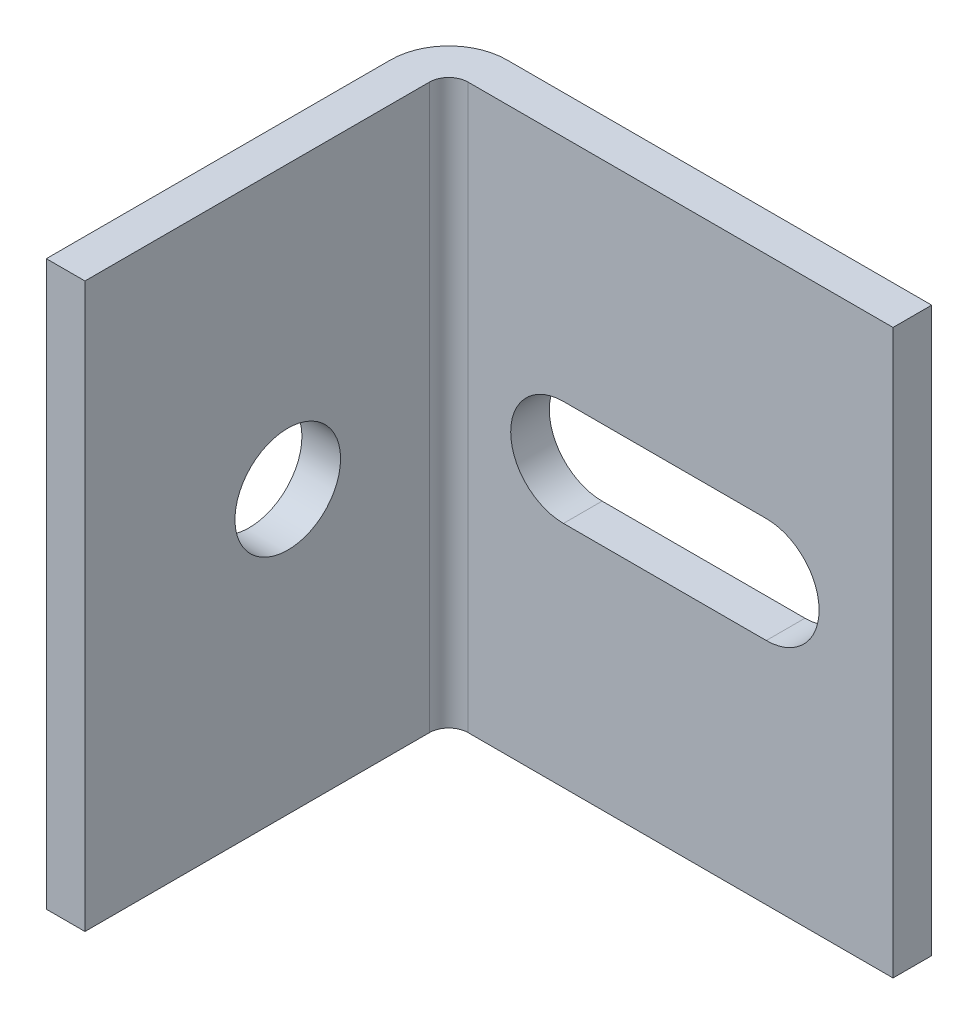
ISO-10303-21;
HEADER;
FILE_DESCRIPTION(('STEP AP214'),'2;1');
FILE_NAME('part.step','',(''),(''),'','','');
FILE_SCHEMA(('AUTOMOTIVE_DESIGN { 1 0 10303 214 1 1 1 1 }'));
ENDSEC;
DATA;
#1=APPLICATION_CONTEXT('core data for automotive mechanical design processes');
#2=APPLICATION_PROTOCOL_DEFINITION('international standard','automotive_design',2000,#1);
#3=PRODUCT_CONTEXT('',#1,'mechanical');
#4=PRODUCT('Part','Part','',(#3));
#5=PRODUCT_RELATED_PRODUCT_CATEGORY('part','',(#4));
#6=PRODUCT_DEFINITION_FORMATION('','',#4);
#7=PRODUCT_DEFINITION_CONTEXT('part definition',#1,'design');
#8=PRODUCT_DEFINITION('design','',#6,#7);
#9=PRODUCT_DEFINITION_SHAPE('','',#8);
#10=(LENGTH_UNIT() NAMED_UNIT(*) SI_UNIT(.MILLI.,.METRE.));
#11=(NAMED_UNIT(*) PLANE_ANGLE_UNIT() SI_UNIT($,.RADIAN.));
#12=(NAMED_UNIT(*) SI_UNIT($,.STERADIAN.) SOLID_ANGLE_UNIT());
#13=UNCERTAINTY_MEASURE_WITH_UNIT(LENGTH_MEASURE(1.E-05),#10,'distance_accuracy_value','');
#14=(GEOMETRIC_REPRESENTATION_CONTEXT(3) GLOBAL_UNCERTAINTY_ASSIGNED_CONTEXT((#13)) GLOBAL_UNIT_ASSIGNED_CONTEXT((#10,
#11,#12)) REPRESENTATION_CONTEXT('',''));
#15=CARTESIAN_POINT('',(0.,0.,0.));
#16=DIRECTION('',(0.,0.,1.));
#17=DIRECTION('',(1.,0.,0.));
#18=AXIS2_PLACEMENT_3D('',#15,#16,#17);
#19=CARTESIAN_POINT('',(2.286,11.1125,1.524));
#20=DIRECTION('',(0.,0.,-1.));
#21=DIRECTION('',(-1.,0.,0.));
#22=AXIS2_PLACEMENT_3D('',#19,#20,#21);
#23=PLANE('',#22);
#24=DIRECTION('',(1.,0.,0.));
#25=VECTOR('',#24,1.);
#26=CARTESIAN_POINT('',(2.286,-11.1125,1.524));
#27=LINE('',#26,#25);
#28=CARTESIAN_POINT('',(2.286,-11.1125,1.524));
#29=VERTEX_POINT('',#28);
#30=CARTESIAN_POINT('',(19.05,-11.1125,1.524));
#31=VERTEX_POINT('',#30);
#32=EDGE_CURVE('E158',#29,#31,#27,.T.);
#33=ORIENTED_EDGE('',*,*,#32,.T.);
#34=DIRECTION('',(0.,-1.,0.));
#35=VECTOR('',#34,1.);
#36=CARTESIAN_POINT('',(19.05,11.1125,1.524));
#37=LINE('',#36,#35);
#38=CARTESIAN_POINT('',(19.05,11.1125,1.524));
#39=VERTEX_POINT('',#38);
#40=EDGE_CURVE('E11',#39,#31,#37,.T.);
#41=ORIENTED_EDGE('',*,*,#40,.F.);
#42=DIRECTION('',(1.,0.,0.));
#43=VECTOR('',#42,1.);
#44=CARTESIAN_POINT('',(2.286,11.1125,1.524));
#45=LINE('',#44,#43);
#46=CARTESIAN_POINT('',(2.286,11.1125,1.524));
#47=VERTEX_POINT('',#46);
#48=EDGE_CURVE('E161',#47,#39,#45,.T.);
#49=ORIENTED_EDGE('',*,*,#48,.F.);
#50=DIRECTION('',(0.,-1.,0.));
#51=VECTOR('',#50,1.);
#52=CARTESIAN_POINT('',(2.286,11.1125,1.524));
#53=LINE('',#52,#51);
#54=EDGE_CURVE('E183',#47,#29,#53,.T.);
#55=ORIENTED_EDGE('',*,*,#54,.T.);
#56=EDGE_LOOP('',(#33,#41,#49,#55));
#57=FACE_BOUND('',#56,.T.);
#58=CARTESIAN_POINT('',(6.05,0.,1.524));
#59=DIRECTION('',(0.,0.,-1.));
#60=DIRECTION('',(-1.,0.,0.));
#61=AXIS2_PLACEMENT_3D('',#58,#59,#60);
#62=CIRCLE('',#61,2.0828);
#63=CARTESIAN_POINT('',(6.05,2.0828,1.524));
#64=VERTEX_POINT('',#63);
#65=CARTESIAN_POINT('',(6.05,-2.0828,1.524));
#66=VERTEX_POINT('',#65);
#67=EDGE_CURVE('E122',#64,#66,#62,.F.);
#68=ORIENTED_EDGE('',*,*,#67,.F.);
#69=DIRECTION('',(-1.,0.,0.));
#70=VECTOR('',#69,1.);
#71=CARTESIAN_POINT('',(2.286,2.0828,1.524));
#72=LINE('',#71,#70);
#73=CARTESIAN_POINT('',(14.05,2.0828,1.524));
#74=VERTEX_POINT('',#73);
#75=EDGE_CURVE('E125',#74,#64,#72,.T.);
#76=ORIENTED_EDGE('',*,*,#75,.F.);
#77=CARTESIAN_POINT('',(14.05,0.,1.524));
#78=DIRECTION('',(0.,0.,-1.));
#79=DIRECTION('',(-1.,0.,0.));
#80=AXIS2_PLACEMENT_3D('',#77,#78,#79);
#81=CIRCLE('',#80,2.0828);
#82=CARTESIAN_POINT('',(14.05,-2.0828,1.524));
#83=VERTEX_POINT('',#82);
#84=EDGE_CURVE('E149',#83,#74,#81,.F.);
#85=ORIENTED_EDGE('',*,*,#84,.F.);
#86=DIRECTION('',(1.,0.,0.));
#87=VECTOR('',#86,1.);
#88=CARTESIAN_POINT('',(2.286,-2.0828,1.524));
#89=LINE('',#88,#87);
#90=EDGE_CURVE('E151',#66,#83,#89,.T.);
#91=ORIENTED_EDGE('',*,*,#90,.F.);
#92=EDGE_LOOP('',(#68,#76,#85,#91));
#93=FACE_BOUND('',#92,.T.);
#94=ADVANCED_FACE('F32',(#57,#93),#23,.F.);
#95=CARTESIAN_POINT('',(2.286,11.1125,0.));
#96=DIRECTION('',(0.,0.,-1.));
#97=DIRECTION('',(-1.,0.,0.));
#98=AXIS2_PLACEMENT_3D('',#95,#96,#97);
#99=PLANE('',#98);
#100=DIRECTION('',(1.,0.,0.));
#101=VECTOR('',#100,1.);
#102=CARTESIAN_POINT('',(2.286,-11.1125,0.));
#103=LINE('',#102,#101);
#104=CARTESIAN_POINT('',(2.286,-11.1125,0.));
#105=VERTEX_POINT('',#104);
#106=CARTESIAN_POINT('',(19.05,-11.1125,0.));
#107=VERTEX_POINT('',#106);
#108=EDGE_CURVE('E189',#105,#107,#103,.T.);
#109=ORIENTED_EDGE('',*,*,#108,.F.);
#110=DIRECTION('',(0.,-1.,0.));
#111=VECTOR('',#110,1.);
#112=CARTESIAN_POINT('',(2.286,11.1125,0.));
#113=LINE('',#112,#111);
#114=CARTESIAN_POINT('',(2.286,11.1125,0.));
#115=VERTEX_POINT('',#114);
#116=EDGE_CURVE('E215',#115,#105,#113,.T.);
#117=ORIENTED_EDGE('',*,*,#116,.F.);
#118=DIRECTION('',(1.,0.,0.));
#119=VECTOR('',#118,1.);
#120=CARTESIAN_POINT('',(2.286,11.1125,0.));
#121=LINE('',#120,#119);
#122=CARTESIAN_POINT('',(19.05,11.1125,0.));
#123=VERTEX_POINT('',#122);
#124=EDGE_CURVE('E167',#115,#123,#121,.T.);
#125=ORIENTED_EDGE('',*,*,#124,.T.);
#126=DIRECTION('',(0.,-1.,0.));
#127=VECTOR('',#126,1.);
#128=CARTESIAN_POINT('',(19.05,11.1125,0.));
#129=LINE('',#128,#127);
#130=EDGE_CURVE('E39',#123,#107,#129,.T.);
#131=ORIENTED_EDGE('',*,*,#130,.T.);
#132=EDGE_LOOP('',(#109,#117,#125,#131));
#133=FACE_BOUND('',#132,.T.);
#134=DIRECTION('',(-1.,0.,0.));
#135=VECTOR('',#134,1.);
#136=CARTESIAN_POINT('',(6.05,2.0828,0.));
#137=LINE('',#136,#135);
#138=CARTESIAN_POINT('',(14.05,2.0828,0.));
#139=VERTEX_POINT('',#138);
#140=CARTESIAN_POINT('',(6.05,2.0828,0.));
#141=VERTEX_POINT('',#140);
#142=EDGE_CURVE('E139',#139,#141,#137,.T.);
#143=ORIENTED_EDGE('',*,*,#142,.T.);
#144=CARTESIAN_POINT('',(6.05,0.,0.));
#145=DIRECTION('',(0.,0.,1.));
#146=DIRECTION('',(1.,0.,0.));
#147=AXIS2_PLACEMENT_3D('',#144,#145,#146);
#148=CIRCLE('',#147,2.0828);
#149=CARTESIAN_POINT('',(6.05,-2.0828,0.));
#150=VERTEX_POINT('',#149);
#151=EDGE_CURVE('E54',#141,#150,#148,.T.);
#152=ORIENTED_EDGE('',*,*,#151,.T.);
#153=DIRECTION('',(1.,0.,0.));
#154=VECTOR('',#153,1.);
#155=CARTESIAN_POINT('',(6.05,-2.0828,0.));
#156=LINE('',#155,#154);
#157=CARTESIAN_POINT('',(14.05,-2.0828,0.));
#158=VERTEX_POINT('',#157);
#159=EDGE_CURVE('E129',#150,#158,#156,.T.);
#160=ORIENTED_EDGE('',*,*,#159,.T.);
#161=CARTESIAN_POINT('',(14.05,0.,0.));
#162=DIRECTION('',(0.,0.,1.));
#163=DIRECTION('',(1.,0.,0.));
#164=AXIS2_PLACEMENT_3D('',#161,#162,#163);
#165=CIRCLE('',#164,2.0828);
#166=EDGE_CURVE('E135',#158,#139,#165,.T.);
#167=ORIENTED_EDGE('',*,*,#166,.T.);
#168=EDGE_LOOP('',(#143,#152,#160,#167));
#169=FACE_BOUND('',#168,.T.);
#170=ADVANCED_FACE('F138',(#133,#169),#99,.T.);
#171=CARTESIAN_POINT('',(19.05,11.1125,0.));
#172=DIRECTION('',(1.,0.,0.));
#173=DIRECTION('',(0.,0.,-1.));
#174=AXIS2_PLACEMENT_3D('',#171,#172,#173);
#175=PLANE('',#174);
#176=DIRECTION('',(0.,0.,1.));
#177=VECTOR('',#176,1.);
#178=CARTESIAN_POINT('',(19.05,-11.1125,0.));
#179=LINE('',#178,#177);
#180=EDGE_CURVE('E186',#107,#31,#179,.T.);
#181=ORIENTED_EDGE('',*,*,#180,.F.);
#182=ORIENTED_EDGE('',*,*,#130,.F.);
#183=DIRECTION('',(0.,0.,1.));
#184=VECTOR('',#183,1.);
#185=CARTESIAN_POINT('',(19.05,11.1125,0.));
#186=LINE('',#185,#184);
#187=EDGE_CURVE('E163',#123,#39,#186,.T.);
#188=ORIENTED_EDGE('',*,*,#187,.T.);
#189=ORIENTED_EDGE('',*,*,#40,.T.);
#190=EDGE_LOOP('',(#181,#182,#188,#189));
#191=FACE_BOUND('',#190,.T.);
#192=ADVANCED_FACE('F222',(#191),#175,.T.);
#193=CARTESIAN_POINT('',(2.286,11.1125,2.286));
#194=DIRECTION('',(0.,-1.,0.));
#195=DIRECTION('',(0.,0.,-1.));
#196=AXIS2_PLACEMENT_3D('',#193,#194,#195);
#197=CYLINDRICAL_SURFACE('',#196,2.286);
#198=CARTESIAN_POINT('',(2.286,-11.1125,2.286));
#199=DIRECTION('',(0.,-1.,0.));
#200=DIRECTION('',(0.,0.,1.));
#201=AXIS2_PLACEMENT_3D('',#198,#199,#200);
#202=CIRCLE('',#201,2.286);
#203=CARTESIAN_POINT('',(0.,-11.1125,2.286));
#204=VERTEX_POINT('',#203);
#205=EDGE_CURVE('E192',#204,#105,#202,.T.);
#206=ORIENTED_EDGE('',*,*,#205,.F.);
#207=DIRECTION('',(0.,-1.,0.));
#208=VECTOR('',#207,1.);
#209=CARTESIAN_POINT('',(0.,11.1125,2.286));
#210=LINE('',#209,#208);
#211=CARTESIAN_POINT('',(0.,11.1125,2.286));
#212=VERTEX_POINT('',#211);
#213=EDGE_CURVE('E213',#212,#204,#210,.T.);
#214=ORIENTED_EDGE('',*,*,#213,.F.);
#215=CARTESIAN_POINT('',(2.286,11.1125,2.286));
#216=DIRECTION('',(0.,-1.,0.));
#217=DIRECTION('',(0.,0.,1.));
#218=AXIS2_PLACEMENT_3D('',#215,#216,#217);
#219=CIRCLE('',#218,2.286);
#220=EDGE_CURVE('E170',#212,#115,#219,.T.);
#221=ORIENTED_EDGE('',*,*,#220,.T.);
#222=ORIENTED_EDGE('',*,*,#116,.T.);
#223=EDGE_LOOP('',(#206,#214,#221,#222));
#224=FACE_BOUND('',#223,.T.);
#225=ADVANCED_FACE('F230',(#224),#197,.T.);
#226=CARTESIAN_POINT('',(0.,11.1125,15.875));
#227=DIRECTION('',(-1.,0.,0.));
#228=DIRECTION('',(0.,0.,1.));
#229=AXIS2_PLACEMENT_3D('',#226,#227,#228);
#230=PLANE('',#229);
#231=CARTESIAN_POINT('',(0.,0.,7.875));
#232=DIRECTION('',(1.,0.,0.));
#233=DIRECTION('',(0.,0.,-1.));
#234=AXIS2_PLACEMENT_3D('',#231,#232,#233);
#235=CIRCLE('',#234,2.0828);
#236=CARTESIAN_POINT('',(0.,0.,5.7922));
#237=VERTEX_POINT('',#236);
#238=EDGE_CURVE('E155',#237,#237,#235,.T.);
#239=ORIENTED_EDGE('',*,*,#238,.T.);
#240=EDGE_LOOP('',(#239));
#241=FACE_BOUND('',#240,.T.);
#242=DIRECTION('',(0.,0.,-1.));
#243=VECTOR('',#242,1.);
#244=CARTESIAN_POINT('',(0.,-11.1125,15.875));
#245=LINE('',#244,#243);
#246=CARTESIAN_POINT('',(0.,-11.1125,15.875));
#247=VERTEX_POINT('',#246);
#248=EDGE_CURVE('E195',#247,#204,#245,.T.);
#249=ORIENTED_EDGE('',*,*,#248,.F.);
#250=DIRECTION('',(0.,-1.,0.));
#251=VECTOR('',#250,1.);
#252=CARTESIAN_POINT('',(0.,11.1125,15.875));
#253=LINE('',#252,#251);
#254=CARTESIAN_POINT('',(0.,11.1125,15.875));
#255=VERTEX_POINT('',#254);
#256=EDGE_CURVE('E211',#255,#247,#253,.T.);
#257=ORIENTED_EDGE('',*,*,#256,.F.);
#258=DIRECTION('',(0.,0.,-1.));
#259=VECTOR('',#258,1.);
#260=CARTESIAN_POINT('',(0.,11.1125,15.875));
#261=LINE('',#260,#259);
#262=EDGE_CURVE('E173',#255,#212,#261,.T.);
#263=ORIENTED_EDGE('',*,*,#262,.T.);
#264=ORIENTED_EDGE('',*,*,#213,.T.);
#265=EDGE_LOOP('',(#249,#257,#263,#264));
#266=FACE_BOUND('',#265,.T.);
#267=ADVANCED_FACE('F253',(#241,#266),#230,.T.);
#268=CARTESIAN_POINT('',(1.524,11.1125,15.875));
#269=DIRECTION('',(0.,0.,1.));
#270=DIRECTION('',(1.,0.,0.));
#271=AXIS2_PLACEMENT_3D('',#268,#269,#270);
#272=PLANE('',#271);
#273=DIRECTION('',(-1.,0.,0.));
#274=VECTOR('',#273,1.);
#275=CARTESIAN_POINT('',(1.524,-11.1125,15.875));
#276=LINE('',#275,#274);
#277=CARTESIAN_POINT('',(1.524,-11.1125,15.875));
#278=VERTEX_POINT('',#277);
#279=EDGE_CURVE('E198',#278,#247,#276,.T.);
#280=ORIENTED_EDGE('',*,*,#279,.F.);
#281=DIRECTION('',(0.,-1.,0.));
#282=VECTOR('',#281,1.);
#283=CARTESIAN_POINT('',(1.524,11.1125,15.875));
#284=LINE('',#283,#282);
#285=CARTESIAN_POINT('',(1.524,11.1125,15.875));
#286=VERTEX_POINT('',#285);
#287=EDGE_CURVE('E209',#286,#278,#284,.T.);
#288=ORIENTED_EDGE('',*,*,#287,.F.);
#289=DIRECTION('',(-1.,0.,0.));
#290=VECTOR('',#289,1.);
#291=CARTESIAN_POINT('',(1.524,11.1125,15.875));
#292=LINE('',#291,#290);
#293=EDGE_CURVE('E176',#286,#255,#292,.T.);
#294=ORIENTED_EDGE('',*,*,#293,.T.);
#295=ORIENTED_EDGE('',*,*,#256,.T.);
#296=EDGE_LOOP('',(#280,#288,#294,#295));
#297=FACE_BOUND('',#296,.T.);
#298=ADVANCED_FACE('F251',(#297),#272,.T.);
#299=CARTESIAN_POINT('',(1.524,11.1125,15.875));
#300=DIRECTION('',(-1.,0.,0.));
#301=DIRECTION('',(0.,0.,1.));
#302=AXIS2_PLACEMENT_3D('',#299,#300,#301);
#303=PLANE('',#302);
#304=CARTESIAN_POINT('',(1.524,0.,7.875));
#305=DIRECTION('',(1.,0.,0.));
#306=DIRECTION('',(0.,0.,-1.));
#307=AXIS2_PLACEMENT_3D('',#304,#305,#306);
#308=CIRCLE('',#307,2.0828);
#309=CARTESIAN_POINT('',(1.524,0.,5.7922));
#310=VERTEX_POINT('',#309);
#311=EDGE_CURVE('E154',#310,#310,#308,.T.);
#312=ORIENTED_EDGE('',*,*,#311,.F.);
#313=EDGE_LOOP('',(#312));
#314=FACE_BOUND('',#313,.T.);
#315=DIRECTION('',(0.,0.,-1.));
#316=VECTOR('',#315,1.);
#317=CARTESIAN_POINT('',(1.524,-11.1125,15.875));
#318=LINE('',#317,#316);
#319=CARTESIAN_POINT('',(1.524,-11.1125,2.286));
#320=VERTEX_POINT('',#319);
#321=EDGE_CURVE('E201',#278,#320,#318,.T.);
#322=ORIENTED_EDGE('',*,*,#321,.T.);
#323=DIRECTION('',(0.,-1.,0.));
#324=VECTOR('',#323,1.);
#325=CARTESIAN_POINT('',(1.524,11.1125,2.286));
#326=LINE('',#325,#324);
#327=CARTESIAN_POINT('',(1.524,11.1125,2.286));
#328=VERTEX_POINT('',#327);
#329=EDGE_CURVE('E206',#328,#320,#326,.T.);
#330=ORIENTED_EDGE('',*,*,#329,.F.);
#331=DIRECTION('',(0.,0.,-1.));
#332=VECTOR('',#331,1.);
#333=CARTESIAN_POINT('',(1.524,11.1125,15.875));
#334=LINE('',#333,#332);
#335=EDGE_CURVE('E179',#286,#328,#334,.T.);
#336=ORIENTED_EDGE('',*,*,#335,.F.);
#337=ORIENTED_EDGE('',*,*,#287,.T.);
#338=EDGE_LOOP('',(#322,#330,#336,#337));
#339=FACE_BOUND('',#338,.T.);
#340=ADVANCED_FACE('F248',(#314,#339),#303,.F.);
#341=CARTESIAN_POINT('',(2.286,11.1125,2.286));
#342=DIRECTION('',(0.,-1.,0.));
#343=DIRECTION('',(0.,0.,-1.));
#344=AXIS2_PLACEMENT_3D('',#341,#342,#343);
#345=CYLINDRICAL_SURFACE('',#344,0.762);
#346=CARTESIAN_POINT('',(2.286,-11.1125,2.286));
#347=DIRECTION('',(0.,1.,0.));
#348=DIRECTION('',(1.,0.,0.));
#349=AXIS2_PLACEMENT_3D('',#346,#347,#348);
#350=CIRCLE('',#349,0.762);
#351=EDGE_CURVE('E164',#320,#29,#350,.F.);
#352=ORIENTED_EDGE('',*,*,#351,.T.);
#353=ORIENTED_EDGE('',*,*,#54,.F.);
#354=CARTESIAN_POINT('',(2.286,11.1125,2.286));
#355=DIRECTION('',(0.,1.,0.));
#356=DIRECTION('',(1.,0.,0.));
#357=AXIS2_PLACEMENT_3D('',#354,#355,#356);
#358=CIRCLE('',#357,0.762);
#359=EDGE_CURVE('E181',#328,#47,#358,.F.);
#360=ORIENTED_EDGE('',*,*,#359,.F.);
#361=ORIENTED_EDGE('',*,*,#329,.T.);
#362=EDGE_LOOP('',(#352,#353,#360,#361));
#363=FACE_BOUND('',#362,.T.);
#364=ADVANCED_FACE('F244',(#363),#345,.F.);
#365=CARTESIAN_POINT('',(2.286,11.1125,2.286));
#366=DIRECTION('',(0.,-1.,0.));
#367=DIRECTION('',(-1.,0.,0.));
#368=AXIS2_PLACEMENT_3D('',#365,#366,#367);
#369=PLANE('',#368);
#370=ORIENTED_EDGE('',*,*,#48,.T.);
#371=ORIENTED_EDGE('',*,*,#187,.F.);
#372=ORIENTED_EDGE('',*,*,#124,.F.);
#373=ORIENTED_EDGE('',*,*,#220,.F.);
#374=ORIENTED_EDGE('',*,*,#262,.F.);
#375=ORIENTED_EDGE('',*,*,#293,.F.);
#376=ORIENTED_EDGE('',*,*,#335,.T.);
#377=ORIENTED_EDGE('',*,*,#359,.T.);
#378=EDGE_LOOP('',(#370,#371,#372,#373,#374,#375,#376,#377));
#379=FACE_BOUND('',#378,.T.);
#380=ADVANCED_FACE('F233',(#379),#369,.F.);
#381=CARTESIAN_POINT('',(2.286,-11.1125,2.286));
#382=DIRECTION('',(0.,-1.,0.));
#383=DIRECTION('',(-1.,0.,0.));
#384=AXIS2_PLACEMENT_3D('',#381,#382,#383);
#385=PLANE('',#384);
#386=ORIENTED_EDGE('',*,*,#32,.F.);
#387=ORIENTED_EDGE('',*,*,#351,.F.);
#388=ORIENTED_EDGE('',*,*,#321,.F.);
#389=ORIENTED_EDGE('',*,*,#279,.T.);
#390=ORIENTED_EDGE('',*,*,#248,.T.);
#391=ORIENTED_EDGE('',*,*,#205,.T.);
#392=ORIENTED_EDGE('',*,*,#108,.T.);
#393=ORIENTED_EDGE('',*,*,#180,.T.);
#394=EDGE_LOOP('',(#386,#387,#388,#389,#390,#391,#392,#393));
#395=FACE_BOUND('',#394,.T.);
#396=ADVANCED_FACE('F226',(#395),#385,.T.);
#397=CARTESIAN_POINT('',(0.,0.,7.875));
#398=DIRECTION('',(1.,0.,0.));
#399=DIRECTION('',(0.,0.,-1.));
#400=AXIS2_PLACEMENT_3D('',#397,#398,#399);
#401=CYLINDRICAL_SURFACE('',#400,2.0828);
#402=CARTESIAN_POINT('',(0.,0.,5.7922));
#403=CARTESIAN_POINT('',(0.0158749999999995,0.,5.7922));
#404=CARTESIAN_POINT('',(0.0317499999999995,0.,5.7922));
#405=CARTESIAN_POINT('',(0.0634999999999995,0.,5.7922));
#406=CARTESIAN_POINT('',(0.0793749999999995,0.,5.7922));
#407=CARTESIAN_POINT('',(0.111124999999999,0.,5.7922));
#408=CARTESIAN_POINT('',(0.126999999999999,0.,5.7922));
#409=CARTESIAN_POINT('',(0.158749999999999,0.,5.7922));
#410=CARTESIAN_POINT('',(0.174624999999999,0.,5.7922));
#411=CARTESIAN_POINT('',(0.206374999999999,0.,5.7922));
#412=CARTESIAN_POINT('',(0.22225,0.,5.7922));
#413=CARTESIAN_POINT('',(0.253999999999999,0.,5.7922));
#414=CARTESIAN_POINT('',(0.269874999999999,0.,5.7922));
#415=CARTESIAN_POINT('',(0.301624999999999,0.,5.7922));
#416=CARTESIAN_POINT('',(0.317499999999999,0.,5.7922));
#417=CARTESIAN_POINT('',(0.349249999999999,0.,5.7922));
#418=CARTESIAN_POINT('',(0.365124999999999,0.,5.7922));
#419=CARTESIAN_POINT('',(0.396874999999999,0.,5.7922));
#420=CARTESIAN_POINT('',(0.41275,0.,5.7922));
#421=CARTESIAN_POINT('',(0.444499999999999,0.,5.7922));
#422=CARTESIAN_POINT('',(0.460374999999999,0.,5.7922));
#423=CARTESIAN_POINT('',(0.492124999999999,0.,5.7922));
#424=CARTESIAN_POINT('',(0.507999999999999,0.,5.7922));
#425=CARTESIAN_POINT('',(0.539749999999999,0.,5.7922));
#426=CARTESIAN_POINT('',(0.555624999999999,0.,5.7922));
#427=CARTESIAN_POINT('',(0.587374999999999,0.,5.7922));
#428=CARTESIAN_POINT('',(0.603249999999999,0.,5.7922));
#429=CARTESIAN_POINT('',(0.634999999999999,0.,5.7922));
#430=CARTESIAN_POINT('',(0.650874999999999,0.,5.7922));
#431=CARTESIAN_POINT('',(0.682624999999999,0.,5.7922));
#432=CARTESIAN_POINT('',(0.698499999999999,0.,5.7922));
#433=CARTESIAN_POINT('',(0.730249999999999,0.,5.7922));
#434=CARTESIAN_POINT('',(0.746124999999999,0.,5.7922));
#435=CARTESIAN_POINT('',(0.777875,0.,5.7922));
#436=CARTESIAN_POINT('',(0.793749999999999,0.,5.7922));
#437=CARTESIAN_POINT('',(0.8255,0.,5.7922));
#438=CARTESIAN_POINT('',(0.841374999999999,0.,5.7922));
#439=CARTESIAN_POINT('',(0.873124999999999,0.,5.7922));
#440=CARTESIAN_POINT('',(0.888999999999999,0.,5.7922));
#441=CARTESIAN_POINT('',(0.92075,0.,5.7922));
#442=CARTESIAN_POINT('',(0.936624999999999,0.,5.7922));
#443=CARTESIAN_POINT('',(0.968375,0.,5.7922));
#444=CARTESIAN_POINT('',(0.984249999999999,0.,5.7922));
#445=CARTESIAN_POINT('',(1.016,0.,5.7922));
#446=CARTESIAN_POINT('',(1.031875,0.,5.7922));
#447=CARTESIAN_POINT('',(1.063625,0.,5.7922));
#448=CARTESIAN_POINT('',(1.0795,0.,5.7922));
#449=CARTESIAN_POINT('',(1.11125,0.,5.7922));
#450=CARTESIAN_POINT('',(1.127125,0.,5.7922));
#451=CARTESIAN_POINT('',(1.158875,0.,5.7922));
#452=CARTESIAN_POINT('',(1.17475,0.,5.7922));
#453=CARTESIAN_POINT('',(1.2065,0.,5.7922));
#454=CARTESIAN_POINT('',(1.222375,0.,5.7922));
#455=CARTESIAN_POINT('',(1.254125,0.,5.7922));
#456=CARTESIAN_POINT('',(1.27,0.,5.7922));
#457=CARTESIAN_POINT('',(1.30175,0.,5.7922));
#458=CARTESIAN_POINT('',(1.317625,0.,5.7922));
#459=CARTESIAN_POINT('',(1.349375,0.,5.7922));
#460=CARTESIAN_POINT('',(1.36525,0.,5.7922));
#461=CARTESIAN_POINT('',(1.397,0.,5.7922));
#462=CARTESIAN_POINT('',(1.412875,0.,5.7922));
#463=CARTESIAN_POINT('',(1.444625,0.,5.7922));
#464=CARTESIAN_POINT('',(1.4605,0.,5.7922));
#465=CARTESIAN_POINT('',(1.49225,0.,5.7922));
#466=CARTESIAN_POINT('',(1.508125,0.,5.7922));
#467=CARTESIAN_POINT('',(1.524,0.,5.7922));
#468=B_SPLINE_CURVE_WITH_KNOTS('',3,(#402,#403,#404,#405,#406,#407,#408,#409,#410,#411,#412,
#413,#414,#415,#416,#417,#418,#419,#420,#421,#422,#423,#424,#425,#426,#427,#428,#429,#430,#431,
#432,#433,#434,#435,#436,#437,#438,#439,#440,#441,#442,#443,#444,#445,#446,#447,#448,#449,#450,
#451,#452,#453,#454,#455,#456,#457,#458,#459,#460,#461,#462,#463,#464,#465,#466,#467),
.UNSPECIFIED.,.F.,.F.,(4,2,2,2,2,2,2,2,2,2,2,2,2,2,2,2,2,2,2,2,2,2,2,2,2,2,2,2,2,2,2,2,4),(0.,
0.047625,0.09525,0.142875,0.1905,0.238125,0.28575,0.333375,0.381,0.428625,0.47625,0.523875,
0.5715,0.619125,0.66675,0.714375,0.762,0.809625,0.85725,0.904875,0.9525,1.000125,1.04775,
1.095375,1.143,1.190625,1.23825,1.285875,1.3335,1.381125,1.42875,1.476375,1.524),.UNSPECIFIED.);
#469=EDGE_CURVE('BSEAM310',#237,#310,#468,.T.);
#470=ORIENTED_EDGE('',*,*,#238,.F.);
#471=ORIENTED_EDGE('',*,*,#311,.T.);
#472=ORIENTED_EDGE('',*,*,#469,.T.);
#473=ORIENTED_EDGE('',*,*,#469,.F.);
#474=EDGE_LOOP('',(#470,#472,#471,#473));
#475=FACE_BOUND('',#474,.T.);
#476=ADVANCED_FACE('F310',(#475),#401,.F.);
#477=CARTESIAN_POINT('',(6.05,0.,15.875));
#478=DIRECTION('',(0.,0.,-1.));
#479=DIRECTION('',(-1.,0.,0.));
#480=AXIS2_PLACEMENT_3D('',#477,#478,#479);
#481=CYLINDRICAL_SURFACE('',#480,2.0828);
#482=ORIENTED_EDGE('',*,*,#67,.T.);
#483=DIRECTION('',(0.,0.,-1.));
#484=VECTOR('',#483,1.);
#485=CARTESIAN_POINT('',(6.05,-2.0828,15.875));
#486=LINE('',#485,#484);
#487=EDGE_CURVE('E118',#66,#150,#486,.T.);
#488=ORIENTED_EDGE('',*,*,#487,.T.);
#489=ORIENTED_EDGE('',*,*,#151,.F.);
#490=DIRECTION('',(0.,0.,-1.));
#491=VECTOR('',#490,1.);
#492=CARTESIAN_POINT('',(6.05,2.0828,15.875));
#493=LINE('',#492,#491);
#494=EDGE_CURVE('E144',#64,#141,#493,.T.);
#495=ORIENTED_EDGE('',*,*,#494,.F.);
#496=EDGE_LOOP('',(#482,#488,#489,#495));
#497=FACE_BOUND('',#496,.T.);
#498=ADVANCED_FACE('F120',(#497),#481,.F.);
#499=CARTESIAN_POINT('',(6.05,-2.0828,15.875));
#500=DIRECTION('',(0.,1.,0.));
#501=DIRECTION('',(0.,0.,1.));
#502=AXIS2_PLACEMENT_3D('',#499,#500,#501);
#503=PLANE('',#502);
#504=ORIENTED_EDGE('',*,*,#90,.T.);
#505=DIRECTION('',(0.,0.,-1.));
#506=VECTOR('',#505,1.);
#507=CARTESIAN_POINT('',(14.05,-2.0828,15.875));
#508=LINE('',#507,#506);
#509=EDGE_CURVE('E126',#83,#158,#508,.T.);
#510=ORIENTED_EDGE('',*,*,#509,.T.);
#511=ORIENTED_EDGE('',*,*,#159,.F.);
#512=ORIENTED_EDGE('',*,*,#487,.F.);
#513=EDGE_LOOP('',(#504,#510,#511,#512));
#514=FACE_BOUND('',#513,.T.);
#515=ADVANCED_FACE('F130',(#514),#503,.T.);
#516=CARTESIAN_POINT('',(14.05,0.,15.875));
#517=DIRECTION('',(0.,0.,-1.));
#518=DIRECTION('',(-1.,0.,0.));
#519=AXIS2_PLACEMENT_3D('',#516,#517,#518);
#520=CYLINDRICAL_SURFACE('',#519,2.0828);
#521=ORIENTED_EDGE('',*,*,#84,.T.);
#522=DIRECTION('',(0.,0.,-1.));
#523=VECTOR('',#522,1.);
#524=CARTESIAN_POINT('',(14.05,2.0828,15.875));
#525=LINE('',#524,#523);
#526=EDGE_CURVE('E46',#74,#139,#525,.T.);
#527=ORIENTED_EDGE('',*,*,#526,.T.);
#528=ORIENTED_EDGE('',*,*,#166,.F.);
#529=ORIENTED_EDGE('',*,*,#509,.F.);
#530=EDGE_LOOP('',(#521,#527,#528,#529));
#531=FACE_BOUND('',#530,.T.);
#532=ADVANCED_FACE('F355',(#531),#520,.F.);
#533=CARTESIAN_POINT('',(6.05,2.0828,15.875));
#534=DIRECTION('',(0.,-1.,0.));
#535=DIRECTION('',(0.,0.,-1.));
#536=AXIS2_PLACEMENT_3D('',#533,#534,#535);
#537=PLANE('',#536);
#538=ORIENTED_EDGE('',*,*,#75,.T.);
#539=ORIENTED_EDGE('',*,*,#494,.T.);
#540=ORIENTED_EDGE('',*,*,#142,.F.);
#541=ORIENTED_EDGE('',*,*,#526,.F.);
#542=EDGE_LOOP('',(#538,#539,#540,#541));
#543=FACE_BOUND('',#542,.T.);
#544=ADVANCED_FACE('F364',(#543),#537,.T.);
#545=CLOSED_SHELL('',(#94,#170,#192,#225,#267,#298,#340,#364,#380,#396,#476,#498,#515,#532,#544));
#546=MANIFOLD_SOLID_BREP('B2',#545);
#547=ADVANCED_BREP_SHAPE_REPRESENTATION('',(#18,#546),#14);
#548=SHAPE_DEFINITION_REPRESENTATION(#9,#547);
ENDSEC;
END-ISO-10303-21;
